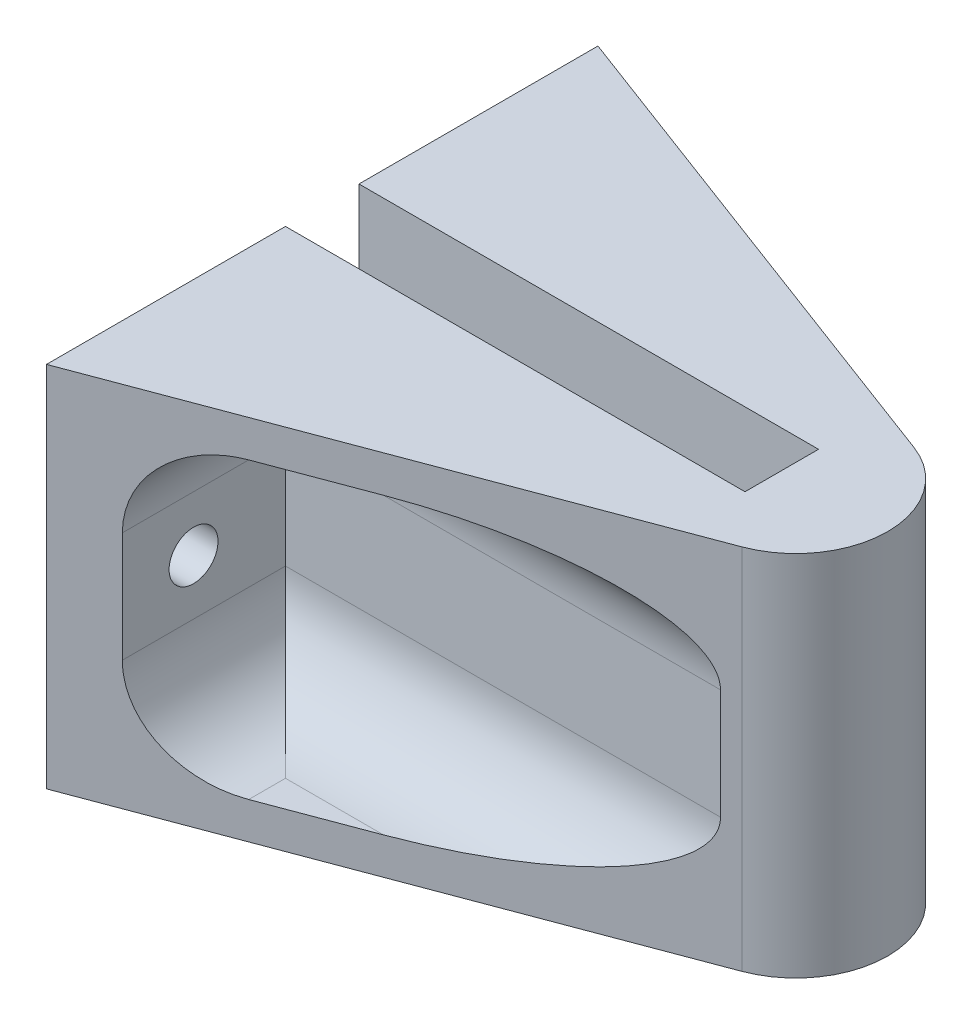
ISO-10303-21;
HEADER;
FILE_DESCRIPTION(('STEP AP214'),'2;1');
FILE_NAME('part.step','',(''),(''),'','','');
FILE_SCHEMA(('AUTOMOTIVE_DESIGN { 1 0 10303 214 1 1 1 1 }'));
ENDSEC;
DATA;
#1=APPLICATION_CONTEXT('core data for automotive mechanical design processes');
#2=APPLICATION_PROTOCOL_DEFINITION('international standard','automotive_design',2000,#1);
#3=PRODUCT_CONTEXT('',#1,'mechanical');
#4=PRODUCT('Part','Part','',(#3));
#5=PRODUCT_RELATED_PRODUCT_CATEGORY('part','',(#4));
#6=PRODUCT_DEFINITION_FORMATION('','',#4);
#7=PRODUCT_DEFINITION_CONTEXT('part definition',#1,'design');
#8=PRODUCT_DEFINITION('design','',#6,#7);
#9=PRODUCT_DEFINITION_SHAPE('','',#8);
#10=(LENGTH_UNIT() NAMED_UNIT(*) SI_UNIT(.MILLI.,.METRE.));
#11=(NAMED_UNIT(*) PLANE_ANGLE_UNIT() SI_UNIT($,.RADIAN.));
#12=(NAMED_UNIT(*) SI_UNIT($,.STERADIAN.) SOLID_ANGLE_UNIT());
#13=UNCERTAINTY_MEASURE_WITH_UNIT(LENGTH_MEASURE(1.E-05),#10,'distance_accuracy_value','');
#14=(GEOMETRIC_REPRESENTATION_CONTEXT(3) GLOBAL_UNCERTAINTY_ASSIGNED_CONTEXT((#13)) GLOBAL_UNIT_ASSIGNED_CONTEXT((#10,
#11,#12)) REPRESENTATION_CONTEXT('',''));
#15=CARTESIAN_POINT('',(0.,0.,0.));
#16=DIRECTION('',(0.,0.,1.));
#17=DIRECTION('',(1.,0.,0.));
#18=AXIS2_PLACEMENT_3D('',#15,#16,#17);
#19=CARTESIAN_POINT('',(0.,20.,0.));
#20=DIRECTION('',(1.,0.,0.));
#21=DIRECTION('',(0.,0.,-1.));
#22=AXIS2_PLACEMENT_3D('',#19,#20,#21);
#23=PLANE('',#22);
#24=CARTESIAN_POINT('',(0.,10.,-25.));
#25=DIRECTION('',(-1.,0.,0.));
#26=DIRECTION('',(0.,0.,1.));
#27=AXIS2_PLACEMENT_3D('',#24,#25,#26);
#28=CIRCLE('',#27,1.33069903722163);
#29=CARTESIAN_POINT('',(0.,10.,-23.6693009627784));
#30=VERTEX_POINT('',#29);
#31=EDGE_CURVE('E333',#30,#30,#28,.T.);
#32=ORIENTED_EDGE('',*,*,#31,.F.);
#33=EDGE_LOOP('',(#32));
#34=FACE_BOUND('',#33,.T.);
#35=DIRECTION('',(0.,0.,1.));
#36=VECTOR('',#35,1.);
#37=CARTESIAN_POINT('',(0.,0.,0.));
#38=LINE('',#37,#36);
#39=CARTESIAN_POINT('',(0.,0.,-30.));
#40=VERTEX_POINT('',#39);
#41=CARTESIAN_POINT('',(0.,0.,-17.));
#42=VERTEX_POINT('',#41);
#43=EDGE_CURVE('E201',#40,#42,#38,.T.);
#44=ORIENTED_EDGE('',*,*,#43,.T.);
#45=DIRECTION('',(0.,1.,0.));
#46=VECTOR('',#45,1.);
#47=CARTESIAN_POINT('',(0.,0.,-17.));
#48=LINE('',#47,#46);
#49=CARTESIAN_POINT('',(0.,20.,-17.));
#50=VERTEX_POINT('',#49);
#51=EDGE_CURVE('E345',#42,#50,#48,.T.);
#52=ORIENTED_EDGE('',*,*,#51,.T.);
#53=DIRECTION('',(0.,0.,1.));
#54=VECTOR('',#53,1.);
#55=CARTESIAN_POINT('',(0.,20.,0.));
#56=LINE('',#55,#54);
#57=CARTESIAN_POINT('',(0.,20.,-30.));
#58=VERTEX_POINT('',#57);
#59=EDGE_CURVE('E212',#58,#50,#56,.T.);
#60=ORIENTED_EDGE('',*,*,#59,.F.);
#61=DIRECTION('',(0.,-1.,0.));
#62=VECTOR('',#61,1.);
#63=CARTESIAN_POINT('',(0.,20.,-30.));
#64=LINE('',#63,#62);
#65=EDGE_CURVE('E211',#58,#40,#64,.T.);
#66=ORIENTED_EDGE('',*,*,#65,.T.);
#67=EDGE_LOOP('',(#44,#52,#60,#66));
#68=FACE_BOUND('',#67,.T.);
#69=ADVANCED_FACE('F35',(#34,#68),#23,.F.);
#70=CARTESIAN_POINT('',(40.,20.,-15.));
#71=DIRECTION('',(-0.351123441588392,0.,-0.936329177569045));
#72=DIRECTION('',(-0.936329177569045,0.,0.351123441588392));
#73=AXIS2_PLACEMENT_3D('',#70,#71,#72);
#74=PLANE('',#73);
#75=DIRECTION('',(0.936329177569045,0.,-0.351123441588392));
#76=VECTOR('',#75,1.);
#77=CARTESIAN_POINT('',(40.,18.,-15.));
#78=LINE('',#77,#76);
#79=CARTESIAN_POINT('',(8.,18.,-3.));
#80=VERTEX_POINT('',#79);
#81=CARTESIAN_POINT('',(13.3333333333334,18.,-5.00000000000001));
#82=VERTEX_POINT('',#81);
#83=EDGE_CURVE('E230',#80,#82,#78,.T.);
#84=ORIENTED_EDGE('',*,*,#83,.T.);
#85=CARTESIAN_POINT('',(13.3333333333334,13.,-5.00000000000001));
#86=DIRECTION('',(-0.351123441588392,0.,-0.936329177569045));
#87=DIRECTION('',(0.936329177569045,0.,-0.351123441588392));
#88=AXIS2_PLACEMENT_3D('',#85,#86,#87);
#89=ELLIPSE('',#88,14.2400062421959,5.);
#90=CARTESIAN_POINT('',(26.6666666666667,13.,-10.));
#91=VERTEX_POINT('',#90);
#92=EDGE_CURVE('E290',#82,#91,#89,.T.);
#93=ORIENTED_EDGE('',*,*,#92,.T.);
#94=DIRECTION('',(0.,-1.,0.));
#95=VECTOR('',#94,1.);
#96=CARTESIAN_POINT('',(26.6666666666667,20.,-10.));
#97=LINE('',#96,#95);
#98=CARTESIAN_POINT('',(26.6666666666667,7.,-10.));
#99=VERTEX_POINT('',#98);
#100=EDGE_CURVE('E233',#91,#99,#97,.T.);
#101=ORIENTED_EDGE('',*,*,#100,.T.);
#102=CARTESIAN_POINT('',(13.3333333333334,7.,-5.00000000000001));
#103=DIRECTION('',(-0.351123441588392,0.,-0.936329177569045));
#104=DIRECTION('',(0.936329177569045,0.,-0.351123441588392));
#105=AXIS2_PLACEMENT_3D('',#102,#103,#104);
#106=ELLIPSE('',#105,14.2400062421959,5.);
#107=CARTESIAN_POINT('',(13.3333333333334,2.,-5.00000000000001));
#108=VERTEX_POINT('',#107);
#109=EDGE_CURVE('E11',#99,#108,#106,.T.);
#110=ORIENTED_EDGE('',*,*,#109,.T.);
#111=DIRECTION('',(-0.936329177569045,0.,0.351123441588392));
#112=VECTOR('',#111,1.);
#113=CARTESIAN_POINT('',(40.,2.,-15.));
#114=LINE('',#113,#112);
#115=CARTESIAN_POINT('',(8.,2.,-3.));
#116=VERTEX_POINT('',#115);
#117=EDGE_CURVE('E236',#108,#116,#114,.T.);
#118=ORIENTED_EDGE('',*,*,#117,.T.);
#119=CARTESIAN_POINT('',(8.,7.,-3.));
#120=DIRECTION('',(-0.351123441588392,0.,-0.936329177569045));
#121=DIRECTION('',(-0.936329177569045,0.,0.351123441588392));
#122=AXIS2_PLACEMENT_3D('',#119,#120,#121);
#123=ELLIPSE('',#122,5.34000234082346,5.);
#124=CARTESIAN_POINT('',(3.,7.,-1.125));
#125=VERTEX_POINT('',#124);
#126=EDGE_CURVE('E44',#116,#125,#123,.T.);
#127=ORIENTED_EDGE('',*,*,#126,.T.);
#128=DIRECTION('',(0.,-1.,0.));
#129=VECTOR('',#128,1.);
#130=CARTESIAN_POINT('',(3.,20.,-1.125));
#131=LINE('',#130,#129);
#132=CARTESIAN_POINT('',(3.,13.,-1.125));
#133=VERTEX_POINT('',#132);
#134=EDGE_CURVE('E227',#133,#125,#131,.T.);
#135=ORIENTED_EDGE('',*,*,#134,.F.);
#136=CARTESIAN_POINT('',(8.,13.,-3.));
#137=DIRECTION('',(-0.351123441588392,0.,-0.936329177569045));
#138=DIRECTION('',(0.936329177569045,0.,-0.351123441588392));
#139=AXIS2_PLACEMENT_3D('',#136,#137,#138);
#140=ELLIPSE('',#139,5.34000234082346,5.);
#141=EDGE_CURVE('E292',#133,#80,#140,.T.);
#142=ORIENTED_EDGE('',*,*,#141,.T.);
#143=EDGE_LOOP('',(#84,#93,#101,#110,#118,#127,#135,#142));
#144=FACE_BOUND('',#143,.T.);
#145=DIRECTION('',(0.936329177569045,0.,-0.351123441588392));
#146=VECTOR('',#145,1.);
#147=CARTESIAN_POINT('',(40.,0.,-15.));
#148=LINE('',#147,#146);
#149=CARTESIAN_POINT('',(0.,0.,0.));
#150=VERTEX_POINT('',#149);
#151=CARTESIAN_POINT('',(27.5156109657461,0.,-10.3183541121548));
#152=VERTEX_POINT('',#151);
#153=EDGE_CURVE('E200',#150,#152,#148,.T.);
#154=ORIENTED_EDGE('',*,*,#153,.T.);
#155=DIRECTION('',(0.,-1.,0.));
#156=VECTOR('',#155,1.);
#157=CARTESIAN_POINT('',(27.5156109657461,20.,-10.3183541121548));
#158=LINE('',#157,#156);
#159=CARTESIAN_POINT('',(27.5156109657461,20.,-10.3183541121548));
#160=VERTEX_POINT('',#159);
#161=EDGE_CURVE('E244',#152,#160,#158,.F.);
#162=ORIENTED_EDGE('',*,*,#161,.T.);
#163=DIRECTION('',(0.936329177569045,0.,-0.351123441588392));
#164=VECTOR('',#163,1.);
#165=CARTESIAN_POINT('',(40.,20.,-15.));
#166=LINE('',#165,#164);
#167=CARTESIAN_POINT('',(0.,20.,0.));
#168=VERTEX_POINT('',#167);
#169=EDGE_CURVE('E205',#168,#160,#166,.T.);
#170=ORIENTED_EDGE('',*,*,#169,.F.);
#171=DIRECTION('',(0.,-1.,0.));
#172=VECTOR('',#171,1.);
#173=CARTESIAN_POINT('',(0.,20.,0.));
#174=LINE('',#173,#172);
#175=EDGE_CURVE('E209',#168,#150,#174,.T.);
#176=ORIENTED_EDGE('',*,*,#175,.T.);
#177=EDGE_LOOP('',(#154,#162,#170,#176));
#178=FACE_BOUND('',#177,.T.);
#179=ADVANCED_FACE('F318',(#144,#178),#74,.F.);
#180=CARTESIAN_POINT('',(0.,20.,-30.));
#181=DIRECTION('',(-0.351123441588392,0.,0.936329177569045));
#182=DIRECTION('',(0.936329177569045,0.,0.351123441588392));
#183=AXIS2_PLACEMENT_3D('',#180,#181,#182);
#184=PLANE('',#183);
#185=DIRECTION('',(0.936329177569045,0.,0.351123441588392));
#186=VECTOR('',#185,1.);
#187=CARTESIAN_POINT('',(0.,2.,-30.));
#188=LINE('',#187,#186);
#189=CARTESIAN_POINT('',(8.,2.,-27.));
#190=VERTEX_POINT('',#189);
#191=CARTESIAN_POINT('',(13.3333333333333,2.,-25.));
#192=VERTEX_POINT('',#191);
#193=EDGE_CURVE('E218',#190,#192,#188,.T.);
#194=ORIENTED_EDGE('',*,*,#193,.T.);
#195=CARTESIAN_POINT('',(13.3333333333333,7.,-25.));
#196=DIRECTION('',(-0.351123441588392,0.,0.936329177569045));
#197=DIRECTION('',(0.936329177569045,0.,0.351123441588392));
#198=AXIS2_PLACEMENT_3D('',#195,#196,#197);
#199=ELLIPSE('',#198,14.2400062421959,5.);
#200=CARTESIAN_POINT('',(26.6666666666667,7.,-20.));
#201=VERTEX_POINT('',#200);
#202=EDGE_CURVE('E284',#192,#201,#199,.T.);
#203=ORIENTED_EDGE('',*,*,#202,.T.);
#204=DIRECTION('',(0.,1.,0.));
#205=VECTOR('',#204,1.);
#206=CARTESIAN_POINT('',(26.6666666666667,20.,-20.));
#207=LINE('',#206,#205);
#208=CARTESIAN_POINT('',(26.6666666666667,13.,-20.));
#209=VERTEX_POINT('',#208);
#210=EDGE_CURVE('E221',#201,#209,#207,.T.);
#211=ORIENTED_EDGE('',*,*,#210,.T.);
#212=CARTESIAN_POINT('',(13.3333333333333,13.,-25.));
#213=DIRECTION('',(-0.351123441588392,0.,0.936329177569045));
#214=DIRECTION('',(0.936329177569045,0.,0.351123441588392));
#215=AXIS2_PLACEMENT_3D('',#212,#213,#214);
#216=ELLIPSE('',#215,14.2400062421959,5.);
#217=CARTESIAN_POINT('',(13.3333333333333,18.,-25.));
#218=VERTEX_POINT('',#217);
#219=EDGE_CURVE('E288',#209,#218,#216,.T.);
#220=ORIENTED_EDGE('',*,*,#219,.T.);
#221=DIRECTION('',(-0.936329177569045,0.,-0.351123441588392));
#222=VECTOR('',#221,1.);
#223=CARTESIAN_POINT('',(0.,18.,-30.));
#224=LINE('',#223,#222);
#225=CARTESIAN_POINT('',(8.,18.,-27.));
#226=VERTEX_POINT('',#225);
#227=EDGE_CURVE('E224',#218,#226,#224,.T.);
#228=ORIENTED_EDGE('',*,*,#227,.T.);
#229=CARTESIAN_POINT('',(8.,13.,-27.));
#230=DIRECTION('',(-0.351123441588392,0.,0.936329177569045));
#231=DIRECTION('',(-0.936329177569045,0.,-0.351123441588392));
#232=AXIS2_PLACEMENT_3D('',#229,#230,#231);
#233=ELLIPSE('',#232,5.34000234082346,5.);
#234=CARTESIAN_POINT('',(3.,13.,-28.875));
#235=VERTEX_POINT('',#234);
#236=EDGE_CURVE('E286',#226,#235,#233,.T.);
#237=ORIENTED_EDGE('',*,*,#236,.T.);
#238=DIRECTION('',(0.,1.,0.));
#239=VECTOR('',#238,1.);
#240=CARTESIAN_POINT('',(3.,20.,-28.875));
#241=LINE('',#240,#239);
#242=CARTESIAN_POINT('',(3.,7.,-28.875));
#243=VERTEX_POINT('',#242);
#244=EDGE_CURVE('E215',#243,#235,#241,.T.);
#245=ORIENTED_EDGE('',*,*,#244,.F.);
#246=CARTESIAN_POINT('',(8.,7.,-27.));
#247=DIRECTION('',(-0.351123441588392,0.,0.936329177569045));
#248=DIRECTION('',(0.936329177569045,0.,0.351123441588392));
#249=AXIS2_PLACEMENT_3D('',#246,#247,#248);
#250=ELLIPSE('',#249,5.34000234082346,5.);
#251=EDGE_CURVE('E282',#243,#190,#250,.T.);
#252=ORIENTED_EDGE('',*,*,#251,.T.);
#253=EDGE_LOOP('',(#194,#203,#211,#220,#228,#237,#245,#252));
#254=FACE_BOUND('',#253,.T.);
#255=DIRECTION('',(-0.936329177569045,0.,-0.351123441588392));
#256=VECTOR('',#255,1.);
#257=CARTESIAN_POINT('',(0.,20.,-30.));
#258=LINE('',#257,#256);
#259=CARTESIAN_POINT('',(27.5156109657461,20.,-19.6816458878452));
#260=VERTEX_POINT('',#259);
#261=EDGE_CURVE('E353',#260,#58,#258,.T.);
#262=ORIENTED_EDGE('',*,*,#261,.F.);
#263=DIRECTION('',(0.,-1.,0.));
#264=VECTOR('',#263,1.);
#265=CARTESIAN_POINT('',(27.5156109657461,20.,-19.6816458878452));
#266=LINE('',#265,#264);
#267=CARTESIAN_POINT('',(27.5156109657461,0.,-19.6816458878452));
#268=VERTEX_POINT('',#267);
#269=EDGE_CURVE('E239',#260,#268,#266,.T.);
#270=ORIENTED_EDGE('',*,*,#269,.T.);
#271=DIRECTION('',(-0.936329177569045,0.,-0.351123441588392));
#272=VECTOR('',#271,1.);
#273=CARTESIAN_POINT('',(0.,0.,-30.));
#274=LINE('',#273,#272);
#275=EDGE_CURVE('E202',#268,#40,#274,.T.);
#276=ORIENTED_EDGE('',*,*,#275,.T.);
#277=ORIENTED_EDGE('',*,*,#65,.F.);
#278=EDGE_LOOP('',(#262,#270,#276,#277));
#279=FACE_BOUND('',#278,.T.);
#280=ADVANCED_FACE('F367',(#254,#279),#184,.F.);
#281=CARTESIAN_POINT('',(0.,10.,-5.));
#282=DIRECTION('',(-1.,0.,0.));
#283=DIRECTION('',(0.,0.,1.));
#284=AXIS2_PLACEMENT_3D('',#281,#282,#283);
#285=CIRCLE('',#284,1.33069903722163);
#286=CARTESIAN_POINT('',(0.,10.,-3.66930096277837));
#287=VERTEX_POINT('',#286);
#288=EDGE_CURVE('E297',#287,#287,#285,.T.);
#289=ORIENTED_EDGE('',*,*,#288,.F.);
#290=EDGE_LOOP('',(#289));
#291=FACE_BOUND('',#290,.T.);
#292=CARTESIAN_POINT('',(0.,20.,-13.));
#293=VERTEX_POINT('',#292);
#294=EDGE_CURVE('E193',#293,#168,#56,.T.);
#295=ORIENTED_EDGE('',*,*,#294,.F.);
#296=DIRECTION('',(0.,1.,0.));
#297=VECTOR('',#296,1.);
#298=CARTESIAN_POINT('',(0.,0.,-13.));
#299=LINE('',#298,#297);
#300=CARTESIAN_POINT('',(0.,0.,-13.));
#301=VERTEX_POINT('',#300);
#302=EDGE_CURVE('E178',#301,#293,#299,.T.);
#303=ORIENTED_EDGE('',*,*,#302,.F.);
#304=EDGE_CURVE('E191',#301,#150,#38,.T.);
#305=ORIENTED_EDGE('',*,*,#304,.T.);
#306=ORIENTED_EDGE('',*,*,#175,.F.);
#307=EDGE_LOOP('',(#295,#303,#305,#306));
#308=FACE_BOUND('',#307,.T.);
#309=ADVANCED_FACE('F189',(#291,#308),#23,.F.);
#310=CARTESIAN_POINT('',(0.,20.,0.));
#311=DIRECTION('',(0.,-1.,0.));
#312=DIRECTION('',(0.,0.,-1.));
#313=AXIS2_PLACEMENT_3D('',#310,#311,#312);
#314=PLANE('',#313);
#315=ORIENTED_EDGE('',*,*,#169,.T.);
#316=CARTESIAN_POINT('',(25.7599937578041,20.,-15.));
#317=DIRECTION('',(0.,-1.,0.));
#318=DIRECTION('',(0.,0.,-1.));
#319=AXIS2_PLACEMENT_3D('',#316,#317,#318);
#320=CIRCLE('',#319,5.);
#321=EDGE_CURVE('E246',#160,#260,#320,.F.);
#322=ORIENTED_EDGE('',*,*,#321,.T.);
#323=ORIENTED_EDGE('',*,*,#261,.T.);
#324=ORIENTED_EDGE('',*,*,#59,.T.);
#325=DIRECTION('',(-1.,0.,0.));
#326=VECTOR('',#325,1.);
#327=CARTESIAN_POINT('',(0.,20.,-17.));
#328=LINE('',#327,#326);
#329=CARTESIAN_POINT('',(25.,20.,-17.));
#330=VERTEX_POINT('',#329);
#331=EDGE_CURVE('E185',#330,#50,#328,.T.);
#332=ORIENTED_EDGE('',*,*,#331,.F.);
#333=DIRECTION('',(0.,0.,-1.));
#334=VECTOR('',#333,1.);
#335=CARTESIAN_POINT('',(25.,20.,-13.));
#336=LINE('',#335,#334);
#337=CARTESIAN_POINT('',(25.,20.,-13.));
#338=VERTEX_POINT('',#337);
#339=EDGE_CURVE('E341',#338,#330,#336,.T.);
#340=ORIENTED_EDGE('',*,*,#339,.F.);
#341=DIRECTION('',(1.,0.,0.));
#342=VECTOR('',#341,1.);
#343=CARTESIAN_POINT('',(0.,20.,-13.));
#344=LINE('',#343,#342);
#345=EDGE_CURVE('E330',#293,#338,#344,.T.);
#346=ORIENTED_EDGE('',*,*,#345,.F.);
#347=ORIENTED_EDGE('',*,*,#294,.T.);
#348=EDGE_LOOP('',(#315,#322,#323,#324,#332,#340,#346,#347));
#349=FACE_BOUND('',#348,.T.);
#350=ADVANCED_FACE('F364',(#349),#314,.F.);
#351=CARTESIAN_POINT('',(0.,0.,0.));
#352=DIRECTION('',(0.,-1.,0.));
#353=DIRECTION('',(0.,0.,-1.));
#354=AXIS2_PLACEMENT_3D('',#351,#352,#353);
#355=PLANE('',#354);
#356=ORIENTED_EDGE('',*,*,#275,.F.);
#357=CARTESIAN_POINT('',(25.7599937578041,0.,-15.));
#358=DIRECTION('',(0.,-1.,0.));
#359=DIRECTION('',(0.,0.,-1.));
#360=AXIS2_PLACEMENT_3D('',#357,#358,#359);
#361=CIRCLE('',#360,5.);
#362=EDGE_CURVE('E242',#268,#152,#361,.T.);
#363=ORIENTED_EDGE('',*,*,#362,.T.);
#364=ORIENTED_EDGE('',*,*,#153,.F.);
#365=ORIENTED_EDGE('',*,*,#304,.F.);
#366=DIRECTION('',(1.,0.,0.));
#367=VECTOR('',#366,1.);
#368=CARTESIAN_POINT('',(0.,0.,-13.));
#369=LINE('',#368,#367);
#370=CARTESIAN_POINT('',(25.,0.,-13.));
#371=VERTEX_POINT('',#370);
#372=EDGE_CURVE('E174',#301,#371,#369,.T.);
#373=ORIENTED_EDGE('',*,*,#372,.T.);
#374=DIRECTION('',(0.,0.,-1.));
#375=VECTOR('',#374,1.);
#376=CARTESIAN_POINT('',(25.,0.,-13.));
#377=LINE('',#376,#375);
#378=CARTESIAN_POINT('',(25.,0.,-17.));
#379=VERTEX_POINT('',#378);
#380=EDGE_CURVE('E184',#371,#379,#377,.T.);
#381=ORIENTED_EDGE('',*,*,#380,.T.);
#382=DIRECTION('',(-1.,0.,0.));
#383=VECTOR('',#382,1.);
#384=CARTESIAN_POINT('',(0.,0.,-17.));
#385=LINE('',#384,#383);
#386=EDGE_CURVE('E194',#379,#42,#385,.T.);
#387=ORIENTED_EDGE('',*,*,#386,.T.);
#388=ORIENTED_EDGE('',*,*,#43,.F.);
#389=EDGE_LOOP('',(#356,#363,#364,#365,#373,#381,#387,#388));
#390=FACE_BOUND('',#389,.T.);
#391=ADVANCED_FACE('F198',(#390),#355,.T.);
#392=CARTESIAN_POINT('',(0.,0.,-17.));
#393=DIRECTION('',(0.,0.,-1.));
#394=DIRECTION('',(-1.,0.,0.));
#395=AXIS2_PLACEMENT_3D('',#392,#393,#394);
#396=PLANE('',#395);
#397=ORIENTED_EDGE('',*,*,#331,.T.);
#398=ORIENTED_EDGE('',*,*,#51,.F.);
#399=ORIENTED_EDGE('',*,*,#386,.F.);
#400=DIRECTION('',(0.,1.,0.));
#401=VECTOR('',#400,1.);
#402=CARTESIAN_POINT('',(25.,0.,-17.));
#403=LINE('',#402,#401);
#404=EDGE_CURVE('E348',#379,#330,#403,.T.);
#405=ORIENTED_EDGE('',*,*,#404,.T.);
#406=EDGE_LOOP('',(#397,#398,#399,#405));
#407=FACE_BOUND('',#406,.T.);
#408=ADVANCED_FACE('F374',(#407),#396,.F.);
#409=CARTESIAN_POINT('',(25.,0.,-13.));
#410=DIRECTION('',(1.,0.,0.));
#411=DIRECTION('',(0.,0.,-1.));
#412=AXIS2_PLACEMENT_3D('',#409,#410,#411);
#413=PLANE('',#412);
#414=ORIENTED_EDGE('',*,*,#339,.T.);
#415=ORIENTED_EDGE('',*,*,#404,.F.);
#416=ORIENTED_EDGE('',*,*,#380,.F.);
#417=DIRECTION('',(0.,1.,0.));
#418=VECTOR('',#417,1.);
#419=CARTESIAN_POINT('',(25.,0.,-13.));
#420=LINE('',#419,#418);
#421=EDGE_CURVE('E180',#371,#338,#420,.T.);
#422=ORIENTED_EDGE('',*,*,#421,.T.);
#423=EDGE_LOOP('',(#414,#415,#416,#422));
#424=FACE_BOUND('',#423,.T.);
#425=ADVANCED_FACE('F377',(#424),#413,.F.);
#426=CARTESIAN_POINT('',(0.,0.,-13.));
#427=DIRECTION('',(0.,0.,1.));
#428=DIRECTION('',(1.,0.,0.));
#429=AXIS2_PLACEMENT_3D('',#426,#427,#428);
#430=PLANE('',#429);
#431=ORIENTED_EDGE('',*,*,#345,.T.);
#432=ORIENTED_EDGE('',*,*,#421,.F.);
#433=ORIENTED_EDGE('',*,*,#372,.F.);
#434=ORIENTED_EDGE('',*,*,#302,.T.);
#435=EDGE_LOOP('',(#431,#432,#433,#434));
#436=FACE_BOUND('',#435,.T.);
#437=ADVANCED_FACE('F177',(#436),#430,.F.);
#438=CARTESIAN_POINT('',(33.,18.,-30.));
#439=DIRECTION('',(0.,1.,0.));
#440=DIRECTION('',(0.,0.,1.));
#441=AXIS2_PLACEMENT_3D('',#438,#439,#440);
#442=PLANE('',#441);
#443=DIRECTION('',(-1.,0.,0.));
#444=VECTOR('',#443,1.);
#445=CARTESIAN_POINT('',(3.,18.,-25.));
#446=LINE('',#445,#444);
#447=CARTESIAN_POINT('',(8.,18.,-25.));
#448=VERTEX_POINT('',#447);
#449=EDGE_CURVE('E261',#218,#448,#446,.T.);
#450=ORIENTED_EDGE('',*,*,#449,.T.);
#451=DIRECTION('',(0.,0.,-1.));
#452=VECTOR('',#451,1.);
#453=CARTESIAN_POINT('',(8.,18.,-30.));
#454=LINE('',#453,#452);
#455=EDGE_CURVE('E263',#448,#226,#454,.T.);
#456=ORIENTED_EDGE('',*,*,#455,.T.);
#457=ORIENTED_EDGE('',*,*,#227,.F.);
#458=EDGE_LOOP('',(#450,#456,#457));
#459=FACE_BOUND('',#458,.T.);
#460=ADVANCED_FACE('F384',(#459),#442,.F.);
#461=CARTESIAN_POINT('',(33.,2.,-20.));
#462=DIRECTION('',(0.,0.,1.));
#463=DIRECTION('',(0.,-1.,0.));
#464=AXIS2_PLACEMENT_3D('',#461,#462,#463);
#465=PLANE('',#464);
#466=ORIENTED_EDGE('',*,*,#210,.F.);
#467=DIRECTION('',(-1.,0.,0.));
#468=VECTOR('',#467,1.);
#469=CARTESIAN_POINT('',(3.,7.,-20.));
#470=LINE('',#469,#468);
#471=CARTESIAN_POINT('',(3.,7.,-20.));
#472=VERTEX_POINT('',#471);
#473=EDGE_CURVE('E259',#201,#472,#470,.T.);
#474=ORIENTED_EDGE('',*,*,#473,.T.);
#475=DIRECTION('',(0.,1.,0.));
#476=VECTOR('',#475,1.);
#477=CARTESIAN_POINT('',(3.,2.,-20.));
#478=LINE('',#477,#476);
#479=CARTESIAN_POINT('',(3.,13.,-20.));
#480=VERTEX_POINT('',#479);
#481=EDGE_CURVE('E326',#472,#480,#478,.T.);
#482=ORIENTED_EDGE('',*,*,#481,.T.);
#483=DIRECTION('',(-1.,0.,0.));
#484=VECTOR('',#483,1.);
#485=CARTESIAN_POINT('',(26.6666666666667,13.,-20.));
#486=LINE('',#485,#484);
#487=EDGE_CURVE('E257',#480,#209,#486,.F.);
#488=ORIENTED_EDGE('',*,*,#487,.T.);
#489=EDGE_LOOP('',(#466,#474,#482,#488));
#490=FACE_BOUND('',#489,.T.);
#491=ADVANCED_FACE('F446',(#490),#465,.F.);
#492=CARTESIAN_POINT('',(33.,2.,-30.));
#493=DIRECTION('',(0.,-1.,0.));
#494=DIRECTION('',(0.,0.,-1.));
#495=AXIS2_PLACEMENT_3D('',#492,#493,#494);
#496=PLANE('',#495);
#497=ORIENTED_EDGE('',*,*,#193,.F.);
#498=DIRECTION('',(0.,0.,1.));
#499=VECTOR('',#498,1.);
#500=CARTESIAN_POINT('',(8.,2.,-30.));
#501=LINE('',#500,#499);
#502=CARTESIAN_POINT('',(8.,2.,-25.));
#503=VERTEX_POINT('',#502);
#504=EDGE_CURVE('E250',#190,#503,#501,.T.);
#505=ORIENTED_EDGE('',*,*,#504,.T.);
#506=DIRECTION('',(-1.,0.,0.));
#507=VECTOR('',#506,1.);
#508=CARTESIAN_POINT('',(26.6666666666667,2.,-25.));
#509=LINE('',#508,#507);
#510=EDGE_CURVE('E248',#503,#192,#509,.F.);
#511=ORIENTED_EDGE('',*,*,#510,.T.);
#512=EDGE_LOOP('',(#497,#505,#511));
#513=FACE_BOUND('',#512,.T.);
#514=ADVANCED_FACE('F442',(#513),#496,.F.);
#515=CARTESIAN_POINT('',(3.,0.,0.));
#516=DIRECTION('',(1.,0.,0.));
#517=DIRECTION('',(0.,0.,-1.));
#518=AXIS2_PLACEMENT_3D('',#515,#516,#517);
#519=PLANE('',#518);
#520=CARTESIAN_POINT('',(3.,10.,-25.));
#521=DIRECTION('',(-1.,0.,0.));
#522=DIRECTION('',(0.,0.,1.));
#523=AXIS2_PLACEMENT_3D('',#520,#521,#522);
#524=CIRCLE('',#523,1.33069903722163);
#525=CARTESIAN_POINT('',(3.,10.,-23.6693009627784));
#526=VERTEX_POINT('',#525);
#527=EDGE_CURVE('E327',#526,#526,#524,.T.);
#528=ORIENTED_EDGE('',*,*,#527,.T.);
#529=EDGE_LOOP('',(#528));
#530=FACE_BOUND('',#529,.T.);
#531=ORIENTED_EDGE('',*,*,#481,.F.);
#532=DIRECTION('',(0.,0.,1.));
#533=VECTOR('',#532,1.);
#534=CARTESIAN_POINT('',(3.,7.,0.));
#535=LINE('',#534,#533);
#536=EDGE_CURVE('E255',#472,#243,#535,.F.);
#537=ORIENTED_EDGE('',*,*,#536,.T.);
#538=ORIENTED_EDGE('',*,*,#244,.T.);
#539=DIRECTION('',(0.,0.,-1.));
#540=VECTOR('',#539,1.);
#541=CARTESIAN_POINT('',(3.,13.,0.));
#542=LINE('',#541,#540);
#543=EDGE_CURVE('E253',#235,#480,#542,.F.);
#544=ORIENTED_EDGE('',*,*,#543,.T.);
#545=EDGE_LOOP('',(#531,#537,#538,#544));
#546=FACE_BOUND('',#545,.T.);
#547=ADVANCED_FACE('F439',(#530,#546),#519,.T.);
#548=CARTESIAN_POINT('',(33.,2.,0.));
#549=DIRECTION('',(0.,-1.,0.));
#550=DIRECTION('',(0.,0.,-1.));
#551=AXIS2_PLACEMENT_3D('',#548,#549,#550);
#552=PLANE('',#551);
#553=DIRECTION('',(-1.,0.,0.));
#554=VECTOR('',#553,1.);
#555=CARTESIAN_POINT('',(3.,2.,-5.00000000000001));
#556=LINE('',#555,#554);
#557=CARTESIAN_POINT('',(8.,2.,-5.00000000000001));
#558=VERTEX_POINT('',#557);
#559=EDGE_CURVE('E52',#108,#558,#556,.T.);
#560=ORIENTED_EDGE('',*,*,#559,.T.);
#561=DIRECTION('',(0.,0.,1.));
#562=VECTOR('',#561,1.);
#563=CARTESIAN_POINT('',(8.,2.,0.));
#564=LINE('',#563,#562);
#565=EDGE_CURVE('E280',#558,#116,#564,.T.);
#566=ORIENTED_EDGE('',*,*,#565,.T.);
#567=ORIENTED_EDGE('',*,*,#117,.F.);
#568=EDGE_LOOP('',(#560,#566,#567));
#569=FACE_BOUND('',#568,.T.);
#570=ADVANCED_FACE('F433',(#569),#552,.F.);
#571=CARTESIAN_POINT('',(33.,2.,-10.));
#572=DIRECTION('',(0.,0.,-1.));
#573=DIRECTION('',(0.,1.,0.));
#574=AXIS2_PLACEMENT_3D('',#571,#572,#573);
#575=PLANE('',#574);
#576=ORIENTED_EDGE('',*,*,#100,.F.);
#577=DIRECTION('',(-1.,0.,0.));
#578=VECTOR('',#577,1.);
#579=CARTESIAN_POINT('',(3.,13.,-10.));
#580=LINE('',#579,#578);
#581=CARTESIAN_POINT('',(3.,13.,-10.));
#582=VERTEX_POINT('',#581);
#583=EDGE_CURVE('E268',#91,#582,#580,.T.);
#584=ORIENTED_EDGE('',*,*,#583,.T.);
#585=DIRECTION('',(0.,-1.,0.));
#586=VECTOR('',#585,1.);
#587=CARTESIAN_POINT('',(3.,2.,-10.));
#588=LINE('',#587,#586);
#589=CARTESIAN_POINT('',(3.,7.,-10.));
#590=VERTEX_POINT('',#589);
#591=EDGE_CURVE('E316',#582,#590,#588,.T.);
#592=ORIENTED_EDGE('',*,*,#591,.T.);
#593=DIRECTION('',(-1.,0.,0.));
#594=VECTOR('',#593,1.);
#595=CARTESIAN_POINT('',(26.6666666666667,7.,-10.));
#596=LINE('',#595,#594);
#597=EDGE_CURVE('E266',#590,#99,#596,.F.);
#598=ORIENTED_EDGE('',*,*,#597,.T.);
#599=EDGE_LOOP('',(#576,#584,#592,#598));
#600=FACE_BOUND('',#599,.T.);
#601=ADVANCED_FACE('F314',(#600),#575,.F.);
#602=CARTESIAN_POINT('',(33.,18.,0.));
#603=DIRECTION('',(0.,1.,0.));
#604=DIRECTION('',(0.,0.,1.));
#605=AXIS2_PLACEMENT_3D('',#602,#603,#604);
#606=PLANE('',#605);
#607=DIRECTION('',(0.,0.,-1.));
#608=VECTOR('',#607,1.);
#609=CARTESIAN_POINT('',(8.,18.,0.));
#610=LINE('',#609,#608);
#611=CARTESIAN_POINT('',(8.,18.,-5.00000000000001));
#612=VERTEX_POINT('',#611);
#613=EDGE_CURVE('E271',#80,#612,#610,.T.);
#614=ORIENTED_EDGE('',*,*,#613,.T.);
#615=DIRECTION('',(-1.,0.,0.));
#616=VECTOR('',#615,1.);
#617=CARTESIAN_POINT('',(26.6666666666667,18.,-5.00000000000001));
#618=LINE('',#617,#616);
#619=EDGE_CURVE('E273',#612,#82,#618,.F.);
#620=ORIENTED_EDGE('',*,*,#619,.T.);
#621=ORIENTED_EDGE('',*,*,#83,.F.);
#622=EDGE_LOOP('',(#614,#620,#621));
#623=FACE_BOUND('',#622,.T.);
#624=ADVANCED_FACE('F427',(#623),#606,.F.);
#625=CARTESIAN_POINT('',(3.,0.,0.));
#626=DIRECTION('',(1.,0.,0.));
#627=DIRECTION('',(0.,0.,-1.));
#628=AXIS2_PLACEMENT_3D('',#625,#626,#627);
#629=PLANE('',#628);
#630=CARTESIAN_POINT('',(3.,10.,-5.));
#631=DIRECTION('',(-1.,0.,0.));
#632=DIRECTION('',(0.,0.,1.));
#633=AXIS2_PLACEMENT_3D('',#630,#631,#632);
#634=CIRCLE('',#633,1.33069903722163);
#635=CARTESIAN_POINT('',(3.,10.,-3.66930096277837));
#636=VERTEX_POINT('',#635);
#637=EDGE_CURVE('E408',#636,#636,#634,.T.);
#638=ORIENTED_EDGE('',*,*,#637,.T.);
#639=EDGE_LOOP('',(#638));
#640=FACE_BOUND('',#639,.T.);
#641=ORIENTED_EDGE('',*,*,#591,.F.);
#642=DIRECTION('',(0.,0.,-1.));
#643=VECTOR('',#642,1.);
#644=CARTESIAN_POINT('',(3.,13.,0.));
#645=LINE('',#644,#643);
#646=EDGE_CURVE('E277',#582,#133,#645,.F.);
#647=ORIENTED_EDGE('',*,*,#646,.T.);
#648=ORIENTED_EDGE('',*,*,#134,.T.);
#649=DIRECTION('',(0.,0.,1.));
#650=VECTOR('',#649,1.);
#651=CARTESIAN_POINT('',(3.,7.,0.));
#652=LINE('',#651,#650);
#653=EDGE_CURVE('E275',#125,#590,#652,.F.);
#654=ORIENTED_EDGE('',*,*,#653,.T.);
#655=EDGE_LOOP('',(#641,#647,#648,#654));
#656=FACE_BOUND('',#655,.T.);
#657=ADVANCED_FACE('F324',(#640,#656),#629,.T.);
#658=CARTESIAN_POINT('',(3.,10.,-25.));
#659=DIRECTION('',(-1.,0.,0.));
#660=DIRECTION('',(0.,0.,1.));
#661=AXIS2_PLACEMENT_3D('',#658,#659,#660);
#662=CYLINDRICAL_SURFACE('',#661,1.33069903722163);
#663=ORIENTED_EDGE('',*,*,#527,.F.);
#664=EDGE_LOOP('',(#663));
#665=FACE_BOUND('',#664,.T.);
#666=ORIENTED_EDGE('',*,*,#31,.T.);
#667=EDGE_LOOP('',(#666));
#668=FACE_BOUND('',#667,.T.);
#669=ADVANCED_FACE('F416',(#665,#668),#662,.F.);
#670=CARTESIAN_POINT('',(3.,10.,-5.));
#671=DIRECTION('',(-1.,0.,0.));
#672=DIRECTION('',(0.,0.,1.));
#673=AXIS2_PLACEMENT_3D('',#670,#671,#672);
#674=CYLINDRICAL_SURFACE('',#673,1.33069903722163);
#675=ORIENTED_EDGE('',*,*,#637,.F.);
#676=EDGE_LOOP('',(#675));
#677=FACE_BOUND('',#676,.T.);
#678=ORIENTED_EDGE('',*,*,#288,.T.);
#679=EDGE_LOOP('',(#678));
#680=FACE_BOUND('',#679,.T.);
#681=ADVANCED_FACE('F418',(#677,#680),#674,.F.);
#682=CARTESIAN_POINT('',(25.7599937578041,20.,-15.));
#683=DIRECTION('',(0.,-1.,0.));
#684=DIRECTION('',(0.,0.,-1.));
#685=AXIS2_PLACEMENT_3D('',#682,#683,#684);
#686=CYLINDRICAL_SURFACE('',#685,5.);
#687=ORIENTED_EDGE('',*,*,#321,.F.);
#688=ORIENTED_EDGE('',*,*,#161,.F.);
#689=ORIENTED_EDGE('',*,*,#362,.F.);
#690=ORIENTED_EDGE('',*,*,#269,.F.);
#691=EDGE_LOOP('',(#687,#688,#689,#690));
#692=FACE_BOUND('',#691,.T.);
#693=ADVANCED_FACE('F360',(#692),#686,.T.);
#694=CARTESIAN_POINT('',(33.,7.,-25.));
#695=DIRECTION('',(1.,0.,0.));
#696=DIRECTION('',(0.,0.,-1.));
#697=AXIS2_PLACEMENT_3D('',#694,#695,#696);
#698=CYLINDRICAL_SURFACE('',#697,5.);
#699=ORIENTED_EDGE('',*,*,#202,.F.);
#700=ORIENTED_EDGE('',*,*,#510,.F.);
#701=CARTESIAN_POINT('',(8.,7.,-25.));
#702=DIRECTION('',(0.707106781186547,0.,0.707106781186547));
#703=DIRECTION('',(-0.707106781186547,0.,0.707106781186547));
#704=AXIS2_PLACEMENT_3D('',#701,#702,#703);
#705=ELLIPSE('',#704,7.07106781186547,5.);
#706=EDGE_CURVE('E295',#472,#503,#705,.T.);
#707=ORIENTED_EDGE('',*,*,#706,.F.);
#708=ORIENTED_EDGE('',*,*,#473,.F.);
#709=EDGE_LOOP('',(#699,#700,#707,#708));
#710=FACE_BOUND('',#709,.T.);
#711=ADVANCED_FACE('F466',(#710),#698,.F.);
#712=CARTESIAN_POINT('',(8.,7.,-30.));
#713=DIRECTION('',(0.,0.,1.));
#714=DIRECTION('',(1.,0.,0.));
#715=AXIS2_PLACEMENT_3D('',#712,#713,#714);
#716=CYLINDRICAL_SURFACE('',#715,5.);
#717=ORIENTED_EDGE('',*,*,#251,.F.);
#718=ORIENTED_EDGE('',*,*,#536,.F.);
#719=ORIENTED_EDGE('',*,*,#706,.T.);
#720=ORIENTED_EDGE('',*,*,#504,.F.);
#721=EDGE_LOOP('',(#717,#718,#719,#720));
#722=FACE_BOUND('',#721,.T.);
#723=ADVANCED_FACE('F461',(#722),#716,.F.);
#724=CARTESIAN_POINT('',(33.,13.,-25.));
#725=DIRECTION('',(1.,0.,0.));
#726=DIRECTION('',(0.,0.,-1.));
#727=AXIS2_PLACEMENT_3D('',#724,#725,#726);
#728=CYLINDRICAL_SURFACE('',#727,5.);
#729=ORIENTED_EDGE('',*,*,#219,.F.);
#730=ORIENTED_EDGE('',*,*,#487,.F.);
#731=CARTESIAN_POINT('',(8.,13.,-25.));
#732=DIRECTION('',(-0.707106781186547,0.,-0.707106781186547));
#733=DIRECTION('',(0.707106781186547,0.,-0.707106781186547));
#734=AXIS2_PLACEMENT_3D('',#731,#732,#733);
#735=ELLIPSE('',#734,7.07106781186547,5.);
#736=EDGE_CURVE('E298',#448,#480,#735,.F.);
#737=ORIENTED_EDGE('',*,*,#736,.F.);
#738=ORIENTED_EDGE('',*,*,#449,.F.);
#739=EDGE_LOOP('',(#729,#730,#737,#738));
#740=FACE_BOUND('',#739,.T.);
#741=ADVANCED_FACE('F473',(#740),#728,.F.);
#742=CARTESIAN_POINT('',(8.,13.,-30.));
#743=DIRECTION('',(0.,0.,-1.));
#744=DIRECTION('',(0.,1.,0.));
#745=AXIS2_PLACEMENT_3D('',#742,#743,#744);
#746=CYLINDRICAL_SURFACE('',#745,5.);
#747=ORIENTED_EDGE('',*,*,#736,.T.);
#748=ORIENTED_EDGE('',*,*,#543,.F.);
#749=ORIENTED_EDGE('',*,*,#236,.F.);
#750=ORIENTED_EDGE('',*,*,#455,.F.);
#751=EDGE_LOOP('',(#747,#748,#749,#750));
#752=FACE_BOUND('',#751,.T.);
#753=ADVANCED_FACE('F478',(#752),#746,.F.);
#754=CARTESIAN_POINT('',(8.,13.,0.));
#755=DIRECTION('',(0.,0.,-1.));
#756=DIRECTION('',(0.,1.,0.));
#757=AXIS2_PLACEMENT_3D('',#754,#755,#756);
#758=CYLINDRICAL_SURFACE('',#757,5.);
#759=ORIENTED_EDGE('',*,*,#141,.F.);
#760=ORIENTED_EDGE('',*,*,#646,.F.);
#761=CARTESIAN_POINT('',(8.,13.,-5.00000000000001));
#762=DIRECTION('',(0.707106781186547,0.,-0.707106781186547));
#763=DIRECTION('',(0.707106781186547,0.,0.707106781186547));
#764=AXIS2_PLACEMENT_3D('',#761,#762,#763);
#765=ELLIPSE('',#764,7.07106781186547,5.);
#766=EDGE_CURVE('E300',#612,#582,#765,.F.);
#767=ORIENTED_EDGE('',*,*,#766,.F.);
#768=ORIENTED_EDGE('',*,*,#613,.F.);
#769=EDGE_LOOP('',(#759,#760,#767,#768));
#770=FACE_BOUND('',#769,.T.);
#771=ADVANCED_FACE('F483',(#770),#758,.F.);
#772=CARTESIAN_POINT('',(33.,13.,-5.00000000000001));
#773=DIRECTION('',(1.,0.,0.));
#774=DIRECTION('',(0.,0.,-1.));
#775=AXIS2_PLACEMENT_3D('',#772,#773,#774);
#776=CYLINDRICAL_SURFACE('',#775,5.);
#777=ORIENTED_EDGE('',*,*,#92,.F.);
#778=ORIENTED_EDGE('',*,*,#619,.F.);
#779=ORIENTED_EDGE('',*,*,#766,.T.);
#780=ORIENTED_EDGE('',*,*,#583,.F.);
#781=EDGE_LOOP('',(#777,#778,#779,#780));
#782=FACE_BOUND('',#781,.T.);
#783=ADVANCED_FACE('F322',(#782),#776,.F.);
#784=CARTESIAN_POINT('',(33.,7.,-5.00000000000001));
#785=DIRECTION('',(1.,0.,0.));
#786=DIRECTION('',(0.,0.,-1.));
#787=AXIS2_PLACEMENT_3D('',#784,#785,#786);
#788=CYLINDRICAL_SURFACE('',#787,5.);
#789=ORIENTED_EDGE('',*,*,#109,.F.);
#790=ORIENTED_EDGE('',*,*,#597,.F.);
#791=CARTESIAN_POINT('',(8.,7.,-5.00000000000001));
#792=DIRECTION('',(-0.707106781186547,0.,0.707106781186547));
#793=DIRECTION('',(0.707106781186547,0.,0.707106781186547));
#794=AXIS2_PLACEMENT_3D('',#791,#792,#793);
#795=ELLIPSE('',#794,7.07106781186547,5.);
#796=EDGE_CURVE('E39',#558,#590,#795,.F.);
#797=ORIENTED_EDGE('',*,*,#796,.F.);
#798=ORIENTED_EDGE('',*,*,#559,.F.);
#799=EDGE_LOOP('',(#789,#790,#797,#798));
#800=FACE_BOUND('',#799,.T.);
#801=ADVANCED_FACE('F37',(#800),#788,.F.);
#802=CARTESIAN_POINT('',(8.,7.,0.));
#803=DIRECTION('',(0.,0.,1.));
#804=DIRECTION('',(1.,0.,0.));
#805=AXIS2_PLACEMENT_3D('',#802,#803,#804);
#806=CYLINDRICAL_SURFACE('',#805,5.);
#807=ORIENTED_EDGE('',*,*,#796,.T.);
#808=ORIENTED_EDGE('',*,*,#653,.F.);
#809=ORIENTED_EDGE('',*,*,#126,.F.);
#810=ORIENTED_EDGE('',*,*,#565,.F.);
#811=EDGE_LOOP('',(#807,#808,#809,#810));
#812=FACE_BOUND('',#811,.T.);
#813=ADVANCED_FACE('F307',(#812),#806,.F.);
#814=CLOSED_SHELL('',(#69,#179,#280,#309,#350,#391,#408,#425,#437,#460,#491,#514,#547,#570,#601,
#624,#657,#669,#681,#693,#711,#723,#741,#753,#771,#783,#801,#813));
#815=MANIFOLD_SOLID_BREP('B2',#814);
#816=ADVANCED_BREP_SHAPE_REPRESENTATION('',(#18,#815),#14);
#817=SHAPE_DEFINITION_REPRESENTATION(#9,#816);
ENDSEC;
END-ISO-10303-21;
